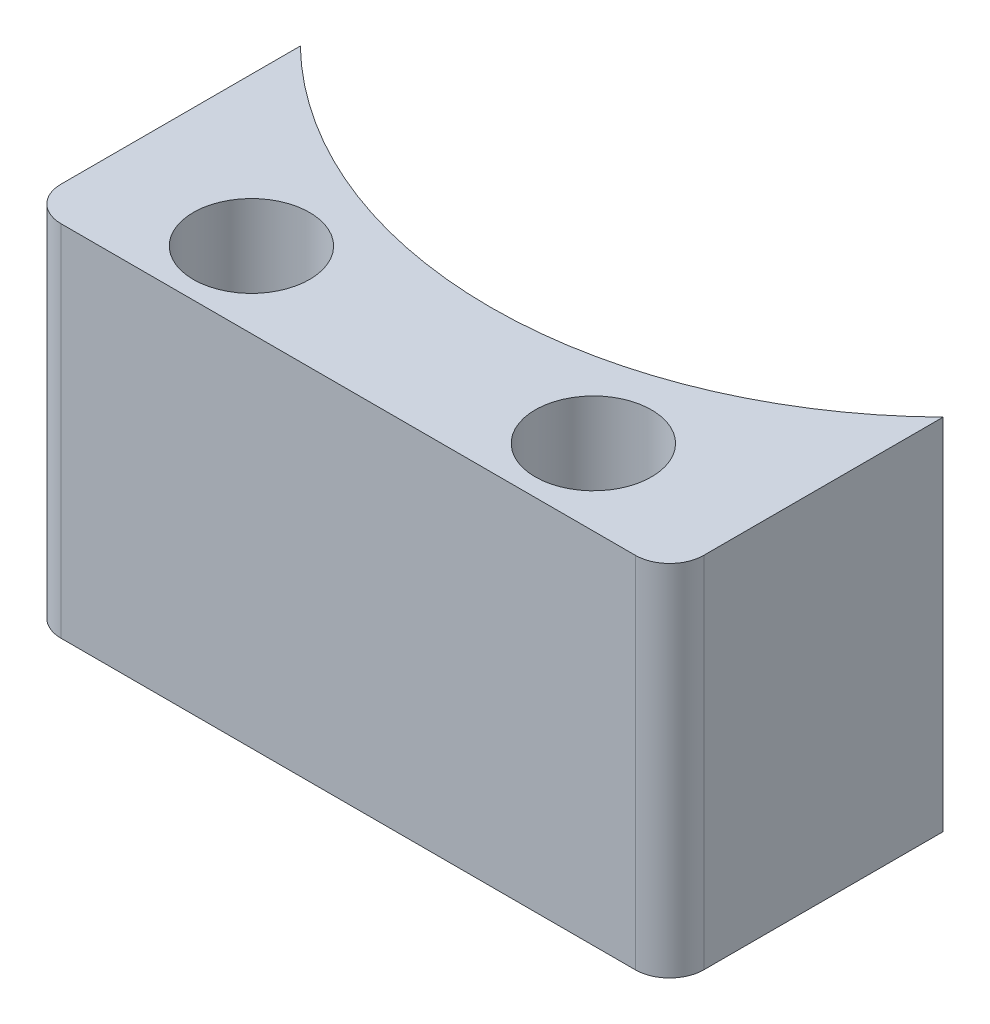
ISO-10303-21;
HEADER;
FILE_DESCRIPTION(('STEP AP214'),'2;1');
FILE_NAME('part.step','',(''),(''),'','','');
FILE_SCHEMA(('AUTOMOTIVE_DESIGN { 1 0 10303 214 1 1 1 1 }'));
ENDSEC;
DATA;
#1=APPLICATION_CONTEXT('core data for automotive mechanical design processes');
#2=APPLICATION_PROTOCOL_DEFINITION('international standard','automotive_design',2000,#1);
#3=PRODUCT_CONTEXT('',#1,'mechanical');
#4=PRODUCT('Part','Part','',(#3));
#5=PRODUCT_RELATED_PRODUCT_CATEGORY('part','',(#4));
#6=PRODUCT_DEFINITION_FORMATION('','',#4);
#7=PRODUCT_DEFINITION_CONTEXT('part definition',#1,'design');
#8=PRODUCT_DEFINITION('design','',#6,#7);
#9=PRODUCT_DEFINITION_SHAPE('','',#8);
#10=(LENGTH_UNIT() NAMED_UNIT(*) SI_UNIT(.MILLI.,.METRE.));
#11=(NAMED_UNIT(*) PLANE_ANGLE_UNIT() SI_UNIT($,.RADIAN.));
#12=(NAMED_UNIT(*) SI_UNIT($,.STERADIAN.) SOLID_ANGLE_UNIT());
#13=UNCERTAINTY_MEASURE_WITH_UNIT(LENGTH_MEASURE(1.E-05),#10,'distance_accuracy_value','');
#14=(GEOMETRIC_REPRESENTATION_CONTEXT(3) GLOBAL_UNCERTAINTY_ASSIGNED_CONTEXT((#13)) GLOBAL_UNIT_ASSIGNED_CONTEXT((#10,
#11,#12)) REPRESENTATION_CONTEXT('',''));
#15=CARTESIAN_POINT('',(0.,0.,0.));
#16=DIRECTION('',(0.,0.,1.));
#17=DIRECTION('',(1.,0.,0.));
#18=AXIS2_PLACEMENT_3D('',#15,#16,#17);
#19=CARTESIAN_POINT('',(9.4,10.5,-9.6));
#20=DIRECTION('',(0.,-1.,0.));
#21=DIRECTION('',(0.,0.,-1.));
#22=AXIS2_PLACEMENT_3D('',#19,#20,#21);
#23=CYLINDRICAL_SURFACE('',#22,13.4357731448547);
#24=CARTESIAN_POINT('',(9.4,0.,-9.6));
#25=DIRECTION('',(0.,-1.,0.));
#26=DIRECTION('',(0.,0.,1.));
#27=AXIS2_PLACEMENT_3D('',#24,#25,#26);
#28=CIRCLE('',#27,13.4357731448547);
#29=CARTESIAN_POINT('',(18.8,0.,0.));
#30=VERTEX_POINT('',#29);
#31=CARTESIAN_POINT('',(0.,0.,0.));
#32=VERTEX_POINT('',#31);
#33=EDGE_CURVE('E109',#30,#32,#28,.T.);
#34=ORIENTED_EDGE('',*,*,#33,.T.);
#35=DIRECTION('',(0.,-1.,0.));
#36=VECTOR('',#35,1.);
#37=CARTESIAN_POINT('',(0.,10.5,0.));
#38=LINE('',#37,#36);
#39=CARTESIAN_POINT('',(0.,10.5,0.));
#40=VERTEX_POINT('',#39);
#41=EDGE_CURVE('E92',#40,#32,#38,.T.);
#42=ORIENTED_EDGE('',*,*,#41,.F.);
#43=CARTESIAN_POINT('',(9.4,10.5,-9.6));
#44=DIRECTION('',(0.,-1.,0.));
#45=DIRECTION('',(0.,0.,1.));
#46=AXIS2_PLACEMENT_3D('',#43,#44,#45);
#47=CIRCLE('',#46,13.4357731448547);
#48=CARTESIAN_POINT('',(18.8,10.5,0.));
#49=VERTEX_POINT('',#48);
#50=EDGE_CURVE('E97',#49,#40,#47,.T.);
#51=ORIENTED_EDGE('',*,*,#50,.F.);
#52=DIRECTION('',(0.,-1.,0.));
#53=VECTOR('',#52,1.);
#54=CARTESIAN_POINT('',(18.8,10.5,0.));
#55=LINE('',#54,#53);
#56=EDGE_CURVE('E111',#49,#30,#55,.T.);
#57=ORIENTED_EDGE('',*,*,#56,.T.);
#58=EDGE_LOOP('',(#34,#42,#51,#57));
#59=FACE_BOUND('',#58,.T.);
#60=ADVANCED_FACE('F36',(#59),#23,.F.);
#61=CARTESIAN_POINT('',(0.,10.5,0.));
#62=DIRECTION('',(1.,0.,0.));
#63=DIRECTION('',(0.,0.,-1.));
#64=AXIS2_PLACEMENT_3D('',#61,#62,#63);
#65=PLANE('',#64);
#66=DIRECTION('',(0.,0.,1.));
#67=VECTOR('',#66,1.);
#68=CARTESIAN_POINT('',(0.,0.,0.));
#69=LINE('',#68,#67);
#70=CARTESIAN_POINT('',(0.,0.,7.));
#71=VERTEX_POINT('',#70);
#72=EDGE_CURVE('E141',#32,#71,#69,.T.);
#73=ORIENTED_EDGE('',*,*,#72,.T.);
#74=DIRECTION('',(0.,-1.,0.));
#75=VECTOR('',#74,1.);
#76=CARTESIAN_POINT('',(0.,10.5,7.));
#77=LINE('',#76,#75);
#78=CARTESIAN_POINT('',(0.,10.5,7.));
#79=VERTEX_POINT('',#78);
#80=EDGE_CURVE('E11',#71,#79,#77,.F.);
#81=ORIENTED_EDGE('',*,*,#80,.T.);
#82=DIRECTION('',(0.,0.,1.));
#83=VECTOR('',#82,1.);
#84=CARTESIAN_POINT('',(0.,10.5,0.));
#85=LINE('',#84,#83);
#86=EDGE_CURVE('E88',#40,#79,#85,.T.);
#87=ORIENTED_EDGE('',*,*,#86,.F.);
#88=ORIENTED_EDGE('',*,*,#41,.T.);
#89=EDGE_LOOP('',(#73,#81,#87,#88));
#90=FACE_BOUND('',#89,.T.);
#91=ADVANCED_FACE('F90',(#90),#65,.F.);
#92=CARTESIAN_POINT('',(0.,10.5,8.));
#93=DIRECTION('',(0.,0.,-1.));
#94=DIRECTION('',(-1.,0.,0.));
#95=AXIS2_PLACEMENT_3D('',#92,#93,#94);
#96=PLANE('',#95);
#97=DIRECTION('',(1.,0.,0.));
#98=VECTOR('',#97,1.);
#99=CARTESIAN_POINT('',(0.,0.,8.));
#100=LINE('',#99,#98);
#101=CARTESIAN_POINT('',(1.,0.,8.));
#102=VERTEX_POINT('',#101);
#103=CARTESIAN_POINT('',(17.8,0.,8.));
#104=VERTEX_POINT('',#103);
#105=EDGE_CURVE('E138',#102,#104,#100,.T.);
#106=ORIENTED_EDGE('',*,*,#105,.T.);
#107=DIRECTION('',(0.,-1.,0.));
#108=VECTOR('',#107,1.);
#109=CARTESIAN_POINT('',(17.8,10.5,8.));
#110=LINE('',#109,#108);
#111=CARTESIAN_POINT('',(17.8,10.5,8.));
#112=VERTEX_POINT('',#111);
#113=EDGE_CURVE('E57',#104,#112,#110,.F.);
#114=ORIENTED_EDGE('',*,*,#113,.T.);
#115=DIRECTION('',(1.,0.,0.));
#116=VECTOR('',#115,1.);
#117=CARTESIAN_POINT('',(0.,10.5,8.));
#118=LINE('',#117,#116);
#119=CARTESIAN_POINT('',(1.,10.5,8.));
#120=VERTEX_POINT('',#119);
#121=EDGE_CURVE('E96',#120,#112,#118,.T.);
#122=ORIENTED_EDGE('',*,*,#121,.F.);
#123=DIRECTION('',(0.,-1.,0.));
#124=VECTOR('',#123,1.);
#125=CARTESIAN_POINT('',(1.,10.5,8.));
#126=LINE('',#125,#124);
#127=EDGE_CURVE('E122',#120,#102,#126,.T.);
#128=ORIENTED_EDGE('',*,*,#127,.T.);
#129=EDGE_LOOP('',(#106,#114,#122,#128));
#130=FACE_BOUND('',#129,.T.);
#131=ADVANCED_FACE('F139',(#130),#96,.F.);
#132=CARTESIAN_POINT('',(18.8,10.5,0.));
#133=DIRECTION('',(-1.,0.,0.));
#134=DIRECTION('',(0.,0.,1.));
#135=AXIS2_PLACEMENT_3D('',#132,#133,#134);
#136=PLANE('',#135);
#137=DIRECTION('',(0.,0.,-1.));
#138=VECTOR('',#137,1.);
#139=CARTESIAN_POINT('',(18.8,10.5,0.));
#140=LINE('',#139,#138);
#141=CARTESIAN_POINT('',(18.8,10.5,7.));
#142=VERTEX_POINT('',#141);
#143=EDGE_CURVE('E102',#142,#49,#140,.T.);
#144=ORIENTED_EDGE('',*,*,#143,.F.);
#145=DIRECTION('',(0.,-1.,0.));
#146=VECTOR('',#145,1.);
#147=CARTESIAN_POINT('',(18.8,10.5,7.));
#148=LINE('',#147,#146);
#149=CARTESIAN_POINT('',(18.8,0.,7.));
#150=VERTEX_POINT('',#149);
#151=EDGE_CURVE('E110',#142,#150,#148,.T.);
#152=ORIENTED_EDGE('',*,*,#151,.T.);
#153=DIRECTION('',(0.,0.,-1.));
#154=VECTOR('',#153,1.);
#155=CARTESIAN_POINT('',(18.8,0.,0.));
#156=LINE('',#155,#154);
#157=EDGE_CURVE('E106',#150,#30,#156,.T.);
#158=ORIENTED_EDGE('',*,*,#157,.T.);
#159=ORIENTED_EDGE('',*,*,#56,.F.);
#160=EDGE_LOOP('',(#144,#152,#158,#159));
#161=FACE_BOUND('',#160,.T.);
#162=ADVANCED_FACE('F131',(#161),#136,.F.);
#163=CARTESIAN_POINT('',(9.4,10.5,-9.6));
#164=DIRECTION('',(0.,1.,0.));
#165=DIRECTION('',(0.,0.,1.));
#166=AXIS2_PLACEMENT_3D('',#163,#164,#165);
#167=PLANE('',#166);
#168=CARTESIAN_POINT('',(4.35024730125826,10.5,5.77922637132028));
#169=DIRECTION('',(0.,1.,0.));
#170=DIRECTION('',(0.,0.,1.));
#171=AXIS2_PLACEMENT_3D('',#168,#169,#170);
#172=CIRCLE('',#171,1.69999999999999);
#173=CARTESIAN_POINT('',(4.35024730125826,10.5,7.47922637132027));
#174=VERTEX_POINT('',#173);
#175=EDGE_CURVE('E156',#174,#174,#172,.T.);
#176=ORIENTED_EDGE('',*,*,#175,.F.);
#177=EDGE_LOOP('',(#176));
#178=FACE_BOUND('',#177,.T.);
#179=CARTESIAN_POINT('',(14.3502473012583,10.5,5.77922637132028));
#180=DIRECTION('',(0.,1.,0.));
#181=DIRECTION('',(0.,0.,1.));
#182=AXIS2_PLACEMENT_3D('',#179,#180,#181);
#183=CIRCLE('',#182,1.69999999999999);
#184=CARTESIAN_POINT('',(14.3502473012583,10.5,7.47922637132027));
#185=VERTEX_POINT('',#184);
#186=EDGE_CURVE('E150',#185,#185,#183,.T.);
#187=ORIENTED_EDGE('',*,*,#186,.F.);
#188=EDGE_LOOP('',(#187));
#189=FACE_BOUND('',#188,.T.);
#190=ORIENTED_EDGE('',*,*,#121,.T.);
#191=CARTESIAN_POINT('',(17.8,10.5,7.));
#192=DIRECTION('',(0.,1.,0.));
#193=DIRECTION('',(0.,0.,1.));
#194=AXIS2_PLACEMENT_3D('',#191,#192,#193);
#195=CIRCLE('',#194,1.);
#196=EDGE_CURVE('E44',#112,#142,#195,.T.);
#197=ORIENTED_EDGE('',*,*,#196,.T.);
#198=ORIENTED_EDGE('',*,*,#143,.T.);
#199=ORIENTED_EDGE('',*,*,#50,.T.);
#200=ORIENTED_EDGE('',*,*,#86,.T.);
#201=CARTESIAN_POINT('',(1.,10.5,7.));
#202=DIRECTION('',(0.,1.,0.));
#203=DIRECTION('',(0.,0.,1.));
#204=AXIS2_PLACEMENT_3D('',#201,#202,#203);
#205=CIRCLE('',#204,1.);
#206=EDGE_CURVE('E126',#79,#120,#205,.T.);
#207=ORIENTED_EDGE('',*,*,#206,.T.);
#208=EDGE_LOOP('',(#190,#197,#198,#199,#200,#207));
#209=FACE_BOUND('',#208,.T.);
#210=ADVANCED_FACE('F100',(#178,#189,#209),#167,.T.);
#211=CARTESIAN_POINT('',(9.4,0.,-9.6));
#212=DIRECTION('',(0.,1.,0.));
#213=DIRECTION('',(0.,0.,1.));
#214=AXIS2_PLACEMENT_3D('',#211,#212,#213);
#215=PLANE('',#214);
#216=CARTESIAN_POINT('',(4.35024730125826,0.,5.77922637132028));
#217=DIRECTION('',(0.,1.,0.));
#218=DIRECTION('',(0.,0.,1.));
#219=AXIS2_PLACEMENT_3D('',#216,#217,#218);
#220=CIRCLE('',#219,1.69999999999999);
#221=CARTESIAN_POINT('',(4.35024730125826,0.,7.47922637132027));
#222=VERTEX_POINT('',#221);
#223=EDGE_CURVE('E153',#222,#222,#220,.T.);
#224=ORIENTED_EDGE('',*,*,#223,.T.);
#225=EDGE_LOOP('',(#224));
#226=FACE_BOUND('',#225,.T.);
#227=CARTESIAN_POINT('',(14.3502473012583,0.,5.77922637132028));
#228=DIRECTION('',(0.,1.,0.));
#229=DIRECTION('',(0.,0.,1.));
#230=AXIS2_PLACEMENT_3D('',#227,#228,#229);
#231=CIRCLE('',#230,1.69999999999999);
#232=CARTESIAN_POINT('',(14.3502473012583,0.,7.47922637132027));
#233=VERTEX_POINT('',#232);
#234=EDGE_CURVE('E145',#233,#233,#231,.T.);
#235=ORIENTED_EDGE('',*,*,#234,.T.);
#236=EDGE_LOOP('',(#235));
#237=FACE_BOUND('',#236,.T.);
#238=ORIENTED_EDGE('',*,*,#157,.F.);
#239=CARTESIAN_POINT('',(17.8,0.,7.));
#240=DIRECTION('',(0.,1.,0.));
#241=DIRECTION('',(0.,0.,1.));
#242=AXIS2_PLACEMENT_3D('',#239,#240,#241);
#243=CIRCLE('',#242,1.);
#244=EDGE_CURVE('E120',#150,#104,#243,.F.);
#245=ORIENTED_EDGE('',*,*,#244,.T.);
#246=ORIENTED_EDGE('',*,*,#105,.F.);
#247=CARTESIAN_POINT('',(1.,0.,7.));
#248=DIRECTION('',(0.,1.,0.));
#249=DIRECTION('',(0.,0.,1.));
#250=AXIS2_PLACEMENT_3D('',#247,#248,#249);
#251=CIRCLE('',#250,1.);
#252=EDGE_CURVE('E114',#102,#71,#251,.F.);
#253=ORIENTED_EDGE('',*,*,#252,.T.);
#254=ORIENTED_EDGE('',*,*,#72,.F.);
#255=ORIENTED_EDGE('',*,*,#33,.F.);
#256=EDGE_LOOP('',(#238,#245,#246,#253,#254,#255));
#257=FACE_BOUND('',#256,.T.);
#258=ADVANCED_FACE('F137',(#226,#237,#257),#215,.F.);
#259=CARTESIAN_POINT('',(17.8,10.5,7.));
#260=DIRECTION('',(0.,-1.,0.));
#261=DIRECTION('',(0.,0.,-1.));
#262=AXIS2_PLACEMENT_3D('',#259,#260,#261);
#263=CYLINDRICAL_SURFACE('',#262,1.);
#264=ORIENTED_EDGE('',*,*,#196,.F.);
#265=ORIENTED_EDGE('',*,*,#113,.F.);
#266=ORIENTED_EDGE('',*,*,#244,.F.);
#267=ORIENTED_EDGE('',*,*,#151,.F.);
#268=EDGE_LOOP('',(#264,#265,#266,#267));
#269=FACE_BOUND('',#268,.T.);
#270=ADVANCED_FACE('F134',(#269),#263,.T.);
#271=CARTESIAN_POINT('',(1.,10.5,7.));
#272=DIRECTION('',(0.,-1.,0.));
#273=DIRECTION('',(0.,0.,-1.));
#274=AXIS2_PLACEMENT_3D('',#271,#272,#273);
#275=CYLINDRICAL_SURFACE('',#274,1.);
#276=ORIENTED_EDGE('',*,*,#206,.F.);
#277=ORIENTED_EDGE('',*,*,#80,.F.);
#278=ORIENTED_EDGE('',*,*,#252,.F.);
#279=ORIENTED_EDGE('',*,*,#127,.F.);
#280=EDGE_LOOP('',(#276,#277,#278,#279));
#281=FACE_BOUND('',#280,.T.);
#282=ADVANCED_FACE('F38',(#281),#275,.T.);
#283=CARTESIAN_POINT('',(14.3502473012583,10.5,5.77922637132028));
#284=DIRECTION('',(0.,1.,0.));
#285=DIRECTION('',(0.,0.,1.));
#286=AXIS2_PLACEMENT_3D('',#283,#284,#285);
#287=CYLINDRICAL_SURFACE('',#286,1.69999999999999);
#288=ORIENTED_EDGE('',*,*,#234,.F.);
#289=EDGE_LOOP('',(#288));
#290=FACE_BOUND('',#289,.T.);
#291=ORIENTED_EDGE('',*,*,#186,.T.);
#292=EDGE_LOOP('',(#291));
#293=FACE_BOUND('',#292,.T.);
#294=ADVANCED_FACE('F167',(#290,#293),#287,.F.);
#295=CARTESIAN_POINT('',(4.35024730125826,10.5,5.77922637132028));
#296=DIRECTION('',(0.,1.,0.));
#297=DIRECTION('',(0.,0.,1.));
#298=AXIS2_PLACEMENT_3D('',#295,#296,#297);
#299=CYLINDRICAL_SURFACE('',#298,1.69999999999999);
#300=ORIENTED_EDGE('',*,*,#223,.F.);
#301=EDGE_LOOP('',(#300));
#302=FACE_BOUND('',#301,.T.);
#303=ORIENTED_EDGE('',*,*,#175,.T.);
#304=EDGE_LOOP('',(#303));
#305=FACE_BOUND('',#304,.T.);
#306=ADVANCED_FACE('F160',(#302,#305),#299,.F.);
#307=CLOSED_SHELL('',(#60,#91,#131,#162,#210,#258,#270,#282,#294,#306));
#308=MANIFOLD_SOLID_BREP('B2',#307);
#309=ADVANCED_BREP_SHAPE_REPRESENTATION('',(#18,#308),#14);
#310=SHAPE_DEFINITION_REPRESENTATION(#9,#309);
ENDSEC;
END-ISO-10303-21;
